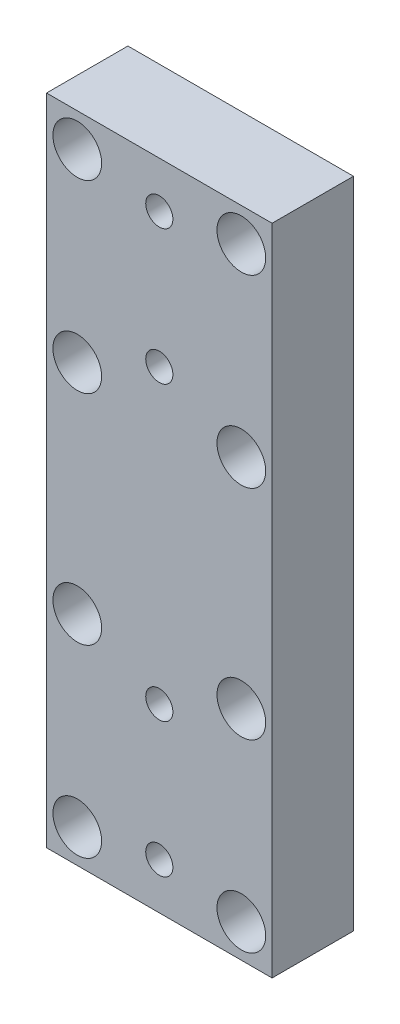
ISO-10303-21;
HEADER;
FILE_DESCRIPTION(('STEP AP214'),'2;1');
FILE_NAME('part.step','',(''),(''),'','','');
FILE_SCHEMA(('AUTOMOTIVE_DESIGN { 1 0 10303 214 1 1 1 1 }'));
ENDSEC;
DATA;
#1=APPLICATION_CONTEXT('core data for automotive mechanical design processes');
#2=APPLICATION_PROTOCOL_DEFINITION('international standard','automotive_design',2000,#1);
#3=PRODUCT_CONTEXT('',#1,'mechanical');
#4=PRODUCT('Part','Part','',(#3));
#5=PRODUCT_RELATED_PRODUCT_CATEGORY('part','',(#4));
#6=PRODUCT_DEFINITION_FORMATION('','',#4);
#7=PRODUCT_DEFINITION_CONTEXT('part definition',#1,'design');
#8=PRODUCT_DEFINITION('design','',#6,#7);
#9=PRODUCT_DEFINITION_SHAPE('','',#8);
#10=(LENGTH_UNIT() NAMED_UNIT(*) SI_UNIT(.MILLI.,.METRE.));
#11=(NAMED_UNIT(*) PLANE_ANGLE_UNIT() SI_UNIT($,.RADIAN.));
#12=(NAMED_UNIT(*) SI_UNIT($,.STERADIAN.) SOLID_ANGLE_UNIT());
#13=UNCERTAINTY_MEASURE_WITH_UNIT(LENGTH_MEASURE(1.E-05),#10,'distance_accuracy_value','');
#14=(GEOMETRIC_REPRESENTATION_CONTEXT(3) GLOBAL_UNCERTAINTY_ASSIGNED_CONTEXT((#13)) GLOBAL_UNIT_ASSIGNED_CONTEXT((#10,
#11,#12)) REPRESENTATION_CONTEXT('',''));
#15=CARTESIAN_POINT('',(0.,0.,0.));
#16=DIRECTION('',(0.,0.,1.));
#17=DIRECTION('',(1.,0.,0.));
#18=AXIS2_PLACEMENT_3D('',#15,#16,#17);
#19=CARTESIAN_POINT('',(-171.45,15.5,15.875));
#20=DIRECTION('',(0.,0.,-1.));
#21=DIRECTION('',(0.,1.,0.));
#22=AXIS2_PLACEMENT_3D('',#19,#20,#21);
#23=CYLINDRICAL_SURFACE('',#22,2.65000000000001);
#24=CARTESIAN_POINT('',(-171.45,15.5,15.875));
#25=DIRECTION('',(0.,0.,1.));
#26=DIRECTION('',(-1.,0.,0.));
#27=AXIS2_PLACEMENT_3D('',#24,#25,#26);
#28=CIRCLE('',#27,2.65000000000001);
#29=CARTESIAN_POINT('',(-174.1,15.5,15.875));
#30=VERTEX_POINT('',#29);
#31=EDGE_CURVE('E54',#30,#30,#28,.T.);
#32=ORIENTED_EDGE('',*,*,#31,.T.);
#33=EDGE_LOOP('',(#32));
#34=FACE_BOUND('',#33,.T.);
#35=CARTESIAN_POINT('',(-171.45,15.5,6.34999999999992));
#36=DIRECTION('',(0.,0.,1.));
#37=DIRECTION('',(-1.,0.,0.));
#38=AXIS2_PLACEMENT_3D('',#35,#36,#37);
#39=CIRCLE('',#38,2.65000000000001);
#40=CARTESIAN_POINT('',(-174.1,15.5,6.34999999999992));
#41=VERTEX_POINT('',#40);
#42=EDGE_CURVE('E410',#41,#41,#39,.T.);
#43=ORIENTED_EDGE('',*,*,#42,.F.);
#44=EDGE_LOOP('',(#43));
#45=FACE_BOUND('',#44,.T.);
#46=ADVANCED_FACE('F45',(#34,#45),#23,.F.);
#47=CARTESIAN_POINT('',(-171.45,-10.7547806533981,15.875));
#48=DIRECTION('',(0.,0.,-1.));
#49=DIRECTION('',(0.,1.,0.));
#50=AXIS2_PLACEMENT_3D('',#47,#48,#49);
#51=CYLINDRICAL_SURFACE('',#50,2.65000000000001);
#52=CARTESIAN_POINT('',(-171.45,-10.7547806533981,15.875));
#53=DIRECTION('',(0.,0.,1.));
#54=DIRECTION('',(-1.,0.,0.));
#55=AXIS2_PLACEMENT_3D('',#52,#53,#54);
#56=CIRCLE('',#55,2.65000000000001);
#57=CARTESIAN_POINT('',(-174.1,-10.7547806533981,15.875));
#58=VERTEX_POINT('',#57);
#59=EDGE_CURVE('E11',#58,#58,#56,.T.);
#60=ORIENTED_EDGE('',*,*,#59,.T.);
#61=EDGE_LOOP('',(#60));
#62=FACE_BOUND('',#61,.T.);
#63=CARTESIAN_POINT('',(-171.45,-10.7547806533981,6.34999999999996));
#64=DIRECTION('',(0.,0.,1.));
#65=DIRECTION('',(-1.,0.,0.));
#66=AXIS2_PLACEMENT_3D('',#63,#64,#65);
#67=CIRCLE('',#66,2.65000000000001);
#68=CARTESIAN_POINT('',(-174.1,-10.7547806533981,6.34999999999996));
#69=VERTEX_POINT('',#68);
#70=EDGE_CURVE('E419',#69,#69,#67,.T.);
#71=ORIENTED_EDGE('',*,*,#70,.F.);
#72=EDGE_LOOP('',(#71));
#73=FACE_BOUND('',#72,.T.);
#74=ADVANCED_FACE('F275',(#62,#73),#51,.F.);
#75=CARTESIAN_POINT('',(-171.45,-94.,53.975));
#76=DIRECTION('',(0.,0.,-1.));
#77=DIRECTION('',(-1.,0.,0.));
#78=AXIS2_PLACEMENT_3D('',#75,#76,#77);
#79=CYLINDRICAL_SURFACE('',#78,2.65000000000001);
#80=CARTESIAN_POINT('',(-171.45,-94.,15.875));
#81=DIRECTION('',(0.,0.,-1.));
#82=DIRECTION('',(-1.,0.,0.));
#83=AXIS2_PLACEMENT_3D('',#80,#81,#82);
#84=CIRCLE('',#83,2.65000000000001);
#85=CARTESIAN_POINT('',(-174.1,-94.,15.875));
#86=VERTEX_POINT('',#85);
#87=EDGE_CURVE('E171',#86,#86,#84,.T.);
#88=ORIENTED_EDGE('',*,*,#87,.F.);
#89=EDGE_LOOP('',(#88));
#90=FACE_BOUND('',#89,.T.);
#91=CARTESIAN_POINT('',(-171.45,-94.,6.35));
#92=DIRECTION('',(0.,0.,-1.));
#93=DIRECTION('',(-1.,0.,0.));
#94=AXIS2_PLACEMENT_3D('',#91,#92,#93);
#95=CIRCLE('',#94,2.65000000000001);
#96=CARTESIAN_POINT('',(-174.1,-94.,6.35));
#97=VERTEX_POINT('',#96);
#98=EDGE_CURVE('E203',#97,#97,#95,.T.);
#99=ORIENTED_EDGE('',*,*,#98,.T.);
#100=EDGE_LOOP('',(#99));
#101=FACE_BOUND('',#100,.T.);
#102=ADVANCED_FACE('F281',(#90,#101),#79,.F.);
#103=CARTESIAN_POINT('',(-171.45,-67.7452193466019,53.975));
#104=DIRECTION('',(0.,0.,-1.));
#105=DIRECTION('',(-1.,0.,0.));
#106=AXIS2_PLACEMENT_3D('',#103,#104,#105);
#107=CYLINDRICAL_SURFACE('',#106,2.65000000000001);
#108=CARTESIAN_POINT('',(-171.45,-67.7452193466019,15.875));
#109=DIRECTION('',(0.,0.,-1.));
#110=DIRECTION('',(-1.,0.,0.));
#111=AXIS2_PLACEMENT_3D('',#108,#109,#110);
#112=CIRCLE('',#111,2.65000000000001);
#113=CARTESIAN_POINT('',(-174.1,-67.7452193466019,15.875));
#114=VERTEX_POINT('',#113);
#115=EDGE_CURVE('E226',#114,#114,#112,.T.);
#116=ORIENTED_EDGE('',*,*,#115,.F.);
#117=EDGE_LOOP('',(#116));
#118=FACE_BOUND('',#117,.T.);
#119=CARTESIAN_POINT('',(-171.45,-67.7452193466019,6.35));
#120=DIRECTION('',(0.,0.,-1.));
#121=DIRECTION('',(-1.,0.,0.));
#122=AXIS2_PLACEMENT_3D('',#119,#120,#121);
#123=CIRCLE('',#122,2.65000000000001);
#124=CARTESIAN_POINT('',(-174.1,-67.7452193466019,6.35));
#125=VERTEX_POINT('',#124);
#126=EDGE_CURVE('E179',#125,#125,#123,.T.);
#127=ORIENTED_EDGE('',*,*,#126,.T.);
#128=EDGE_LOOP('',(#127));
#129=FACE_BOUND('',#128,.T.);
#130=ADVANCED_FACE('F272',(#118,#129),#107,.F.);
#131=CARTESIAN_POINT('',(0.,0.,6.35));
#132=DIRECTION('',(0.,0.,1.));
#133=DIRECTION('',(1.,0.,0.));
#134=AXIS2_PLACEMENT_3D('',#131,#132,#133);
#135=PLANE('',#134);
#136=CARTESIAN_POINT('',(-155.45,-96.5,6.35));
#137=DIRECTION('',(0.,0.,1.));
#138=DIRECTION('',(1.,0.,0.));
#139=AXIS2_PLACEMENT_3D('',#136,#137,#138);
#140=CIRCLE('',#139,2.64999999999999);
#141=CARTESIAN_POINT('',(-152.8,-96.5,6.35));
#142=VERTEX_POINT('',#141);
#143=EDGE_CURVE('E114',#142,#142,#140,.T.);
#144=ORIENTED_EDGE('',*,*,#143,.F.);
#145=EDGE_LOOP('',(#144));
#146=FACE_BOUND('',#145,.T.);
#147=CARTESIAN_POINT('',(-155.45,-96.5,6.35));
#148=DIRECTION('',(0.,0.,1.));
#149=DIRECTION('',(1.,0.,0.));
#150=AXIS2_PLACEMENT_3D('',#147,#148,#149);
#151=CIRCLE('',#150,4.75000000000001);
#152=CARTESIAN_POINT('',(-150.7,-96.5,6.35));
#153=VERTEX_POINT('',#152);
#154=EDGE_CURVE('E175',#153,#153,#151,.T.);
#155=ORIENTED_EDGE('',*,*,#154,.T.);
#156=EDGE_LOOP('',(#155));
#157=FACE_BOUND('',#156,.T.);
#158=ADVANCED_FACE('F258',(#146,#157),#135,.T.);
#159=CARTESIAN_POINT('',(-155.45,-60.5,6.35));
#160=DIRECTION('',(0.,0.,1.));
#161=DIRECTION('',(1.,0.,0.));
#162=AXIS2_PLACEMENT_3D('',#159,#160,#161);
#163=CIRCLE('',#162,2.65000000000002);
#164=CARTESIAN_POINT('',(-152.8,-60.5,6.35));
#165=VERTEX_POINT('',#164);
#166=EDGE_CURVE('E121',#165,#165,#163,.T.);
#167=ORIENTED_EDGE('',*,*,#166,.F.);
#168=EDGE_LOOP('',(#167));
#169=FACE_BOUND('',#168,.T.);
#170=CARTESIAN_POINT('',(-155.45,-60.5,6.35));
#171=DIRECTION('',(0.,0.,1.));
#172=DIRECTION('',(1.,0.,0.));
#173=AXIS2_PLACEMENT_3D('',#170,#171,#172);
#174=CIRCLE('',#173,4.75000000000001);
#175=CARTESIAN_POINT('',(-150.7,-60.5,6.35));
#176=VERTEX_POINT('',#175);
#177=EDGE_CURVE('E178',#176,#176,#174,.T.);
#178=ORIENTED_EDGE('',*,*,#177,.T.);
#179=EDGE_LOOP('',(#178));
#180=FACE_BOUND('',#179,.T.);
#181=ADVANCED_FACE('F271',(#169,#180),#135,.T.);
#182=CARTESIAN_POINT('',(-187.45,-18.,6.35));
#183=DIRECTION('',(0.,0.,1.));
#184=DIRECTION('',(1.,0.,0.));
#185=AXIS2_PLACEMENT_3D('',#182,#183,#184);
#186=CIRCLE('',#185,2.64999999999999);
#187=CARTESIAN_POINT('',(-184.8,-18.,6.35));
#188=VERTEX_POINT('',#187);
#189=EDGE_CURVE('E127',#188,#188,#186,.T.);
#190=ORIENTED_EDGE('',*,*,#189,.F.);
#191=EDGE_LOOP('',(#190));
#192=FACE_BOUND('',#191,.T.);
#193=CARTESIAN_POINT('',(-187.45,-18.,6.35));
#194=DIRECTION('',(0.,0.,1.));
#195=DIRECTION('',(1.,0.,0.));
#196=AXIS2_PLACEMENT_3D('',#193,#194,#195);
#197=CIRCLE('',#196,4.75);
#198=CARTESIAN_POINT('',(-182.7,-18.,6.35));
#199=VERTEX_POINT('',#198);
#200=EDGE_CURVE('E185',#199,#199,#197,.T.);
#201=ORIENTED_EDGE('',*,*,#200,.T.);
#202=EDGE_LOOP('',(#201));
#203=FACE_BOUND('',#202,.T.);
#204=ADVANCED_FACE('F345',(#192,#203),#135,.T.);
#205=CARTESIAN_POINT('',(-155.45,18.,6.35));
#206=DIRECTION('',(0.,0.,1.));
#207=DIRECTION('',(1.,0.,0.));
#208=AXIS2_PLACEMENT_3D('',#205,#206,#207);
#209=CIRCLE('',#208,2.64999999999999);
#210=CARTESIAN_POINT('',(-152.8,18.,6.35));
#211=VERTEX_POINT('',#210);
#212=EDGE_CURVE('E133',#211,#211,#209,.T.);
#213=ORIENTED_EDGE('',*,*,#212,.F.);
#214=EDGE_LOOP('',(#213));
#215=FACE_BOUND('',#214,.T.);
#216=CARTESIAN_POINT('',(-155.45,18.,6.35));
#217=DIRECTION('',(0.,0.,1.));
#218=DIRECTION('',(1.,0.,0.));
#219=AXIS2_PLACEMENT_3D('',#216,#217,#218);
#220=CIRCLE('',#219,4.75);
#221=CARTESIAN_POINT('',(-150.7,18.,6.35));
#222=VERTEX_POINT('',#221);
#223=EDGE_CURVE('E191',#222,#222,#220,.T.);
#224=ORIENTED_EDGE('',*,*,#223,.T.);
#225=EDGE_LOOP('',(#224));
#226=FACE_BOUND('',#225,.T.);
#227=ADVANCED_FACE('F342',(#215,#226),#135,.T.);
#228=CARTESIAN_POINT('',(-187.45,18.,6.35));
#229=DIRECTION('',(0.,0.,1.));
#230=DIRECTION('',(1.,0.,0.));
#231=AXIS2_PLACEMENT_3D('',#228,#229,#230);
#232=CIRCLE('',#231,2.64999999999999);
#233=CARTESIAN_POINT('',(-184.8,18.,6.35));
#234=VERTEX_POINT('',#233);
#235=EDGE_CURVE('E130',#234,#234,#232,.T.);
#236=ORIENTED_EDGE('',*,*,#235,.F.);
#237=EDGE_LOOP('',(#236));
#238=FACE_BOUND('',#237,.T.);
#239=CARTESIAN_POINT('',(-187.45,18.,6.35));
#240=DIRECTION('',(0.,0.,1.));
#241=DIRECTION('',(1.,0.,0.));
#242=AXIS2_PLACEMENT_3D('',#239,#240,#241);
#243=CIRCLE('',#242,4.75);
#244=CARTESIAN_POINT('',(-182.7,18.,6.35));
#245=VERTEX_POINT('',#244);
#246=EDGE_CURVE('E188',#245,#245,#243,.T.);
#247=ORIENTED_EDGE('',*,*,#246,.T.);
#248=EDGE_LOOP('',(#247));
#249=FACE_BOUND('',#248,.T.);
#250=ADVANCED_FACE('F344',(#238,#249),#135,.T.);
#251=CARTESIAN_POINT('',(-155.45,-18.,6.35));
#252=DIRECTION('',(0.,0.,1.));
#253=DIRECTION('',(1.,0.,0.));
#254=AXIS2_PLACEMENT_3D('',#251,#252,#253);
#255=CIRCLE('',#254,2.64999999999999);
#256=CARTESIAN_POINT('',(-152.8,-18.,6.35));
#257=VERTEX_POINT('',#256);
#258=EDGE_CURVE('E124',#257,#257,#255,.T.);
#259=ORIENTED_EDGE('',*,*,#258,.F.);
#260=EDGE_LOOP('',(#259));
#261=FACE_BOUND('',#260,.T.);
#262=CARTESIAN_POINT('',(-155.45,-18.,6.35));
#263=DIRECTION('',(0.,0.,1.));
#264=DIRECTION('',(1.,0.,0.));
#265=AXIS2_PLACEMENT_3D('',#262,#263,#264);
#266=CIRCLE('',#265,4.75);
#267=CARTESIAN_POINT('',(-150.7,-18.,6.35));
#268=VERTEX_POINT('',#267);
#269=EDGE_CURVE('E182',#268,#268,#266,.T.);
#270=ORIENTED_EDGE('',*,*,#269,.T.);
#271=EDGE_LOOP('',(#270));
#272=FACE_BOUND('',#271,.T.);
#273=ADVANCED_FACE('F266',(#261,#272),#135,.T.);
#274=CARTESIAN_POINT('',(-187.45,-60.5,6.35));
#275=DIRECTION('',(0.,0.,1.));
#276=DIRECTION('',(1.,0.,0.));
#277=AXIS2_PLACEMENT_3D('',#274,#275,#276);
#278=CIRCLE('',#277,2.64999999999998);
#279=CARTESIAN_POINT('',(-184.8,-60.5,6.35));
#280=VERTEX_POINT('',#279);
#281=EDGE_CURVE('E117',#280,#280,#278,.T.);
#282=ORIENTED_EDGE('',*,*,#281,.F.);
#283=EDGE_LOOP('',(#282));
#284=FACE_BOUND('',#283,.T.);
#285=CARTESIAN_POINT('',(-187.45,-60.5,6.35));
#286=DIRECTION('',(0.,0.,1.));
#287=DIRECTION('',(1.,0.,0.));
#288=AXIS2_PLACEMENT_3D('',#285,#286,#287);
#289=CIRCLE('',#288,4.75000000000001);
#290=CARTESIAN_POINT('',(-182.7,-60.5,6.35));
#291=VERTEX_POINT('',#290);
#292=EDGE_CURVE('E174',#291,#291,#289,.T.);
#293=ORIENTED_EDGE('',*,*,#292,.T.);
#294=EDGE_LOOP('',(#293));
#295=FACE_BOUND('',#294,.T.);
#296=ADVANCED_FACE('F255',(#284,#295),#135,.T.);
#297=CARTESIAN_POINT('',(-187.45,-96.5,6.35));
#298=DIRECTION('',(0.,0.,1.));
#299=DIRECTION('',(1.,0.,0.));
#300=AXIS2_PLACEMENT_3D('',#297,#298,#299);
#301=CIRCLE('',#300,2.64999999999999);
#302=CARTESIAN_POINT('',(-184.8,-96.5,6.35));
#303=VERTEX_POINT('',#302);
#304=EDGE_CURVE('E99',#303,#303,#301,.T.);
#305=ORIENTED_EDGE('',*,*,#304,.F.);
#306=EDGE_LOOP('',(#305));
#307=FACE_BOUND('',#306,.T.);
#308=CARTESIAN_POINT('',(-187.45,-96.5,6.35));
#309=DIRECTION('',(0.,0.,1.));
#310=DIRECTION('',(1.,0.,0.));
#311=AXIS2_PLACEMENT_3D('',#308,#309,#310);
#312=CIRCLE('',#311,4.75000000000001);
#313=CARTESIAN_POINT('',(-182.7,-96.5,6.35));
#314=VERTEX_POINT('',#313);
#315=EDGE_CURVE('E169',#314,#314,#312,.T.);
#316=ORIENTED_EDGE('',*,*,#315,.T.);
#317=EDGE_LOOP('',(#316));
#318=FACE_BOUND('',#317,.T.);
#319=ADVANCED_FACE('F253',(#307,#318),#135,.T.);
#320=CARTESIAN_POINT('',(-149.45,0.,6.35));
#321=DIRECTION('',(1.,0.,0.));
#322=DIRECTION('',(0.,0.,-1.));
#323=AXIS2_PLACEMENT_3D('',#320,#321,#322);
#324=PLANE('',#323);
#325=DIRECTION('',(0.,-1.,0.));
#326=VECTOR('',#325,1.);
#327=CARTESIAN_POINT('',(-149.45,0.,0.));
#328=LINE('',#327,#326);
#329=CARTESIAN_POINT('',(-149.45,24.5,0.));
#330=VERTEX_POINT('',#329);
#331=CARTESIAN_POINT('',(-149.45,-103.,0.));
#332=VERTEX_POINT('',#331);
#333=EDGE_CURVE('E95',#330,#332,#328,.T.);
#334=ORIENTED_EDGE('',*,*,#333,.F.);
#335=DIRECTION('',(0.,0.,-1.));
#336=VECTOR('',#335,1.);
#337=CARTESIAN_POINT('',(-149.45,24.5,6.35));
#338=LINE('',#337,#336);
#339=CARTESIAN_POINT('',(-149.45,24.5,15.875));
#340=VERTEX_POINT('',#339);
#341=EDGE_CURVE('E76',#340,#330,#338,.T.);
#342=ORIENTED_EDGE('',*,*,#341,.F.);
#343=DIRECTION('',(0.,-1.,0.));
#344=VECTOR('',#343,1.);
#345=CARTESIAN_POINT('',(-149.45,0.,15.875));
#346=LINE('',#345,#344);
#347=CARTESIAN_POINT('',(-149.45,-103.,15.875));
#348=VERTEX_POINT('',#347);
#349=EDGE_CURVE('E167',#340,#348,#346,.T.);
#350=ORIENTED_EDGE('',*,*,#349,.T.);
#351=DIRECTION('',(0.,0.,-1.));
#352=VECTOR('',#351,1.);
#353=CARTESIAN_POINT('',(-149.45,-103.,6.35));
#354=LINE('',#353,#352);
#355=EDGE_CURVE('E62',#348,#332,#354,.T.);
#356=ORIENTED_EDGE('',*,*,#355,.T.);
#357=EDGE_LOOP('',(#334,#342,#350,#356));
#358=FACE_BOUND('',#357,.T.);
#359=ADVANCED_FACE('F96',(#358),#324,.T.);
#360=CARTESIAN_POINT('',(0.,24.5,6.35));
#361=DIRECTION('',(0.,1.,0.));
#362=DIRECTION('',(0.,0.,1.));
#363=AXIS2_PLACEMENT_3D('',#360,#361,#362);
#364=PLANE('',#363);
#365=DIRECTION('',(1.,0.,0.));
#366=VECTOR('',#365,1.);
#367=CARTESIAN_POINT('',(0.,24.5,0.));
#368=LINE('',#367,#366);
#369=CARTESIAN_POINT('',(-193.45,24.5,0.));
#370=VERTEX_POINT('',#369);
#371=EDGE_CURVE('E89',#370,#330,#368,.T.);
#372=ORIENTED_EDGE('',*,*,#371,.F.);
#373=DIRECTION('',(0.,0.,-1.));
#374=VECTOR('',#373,1.);
#375=CARTESIAN_POINT('',(-193.45,24.5,6.35));
#376=LINE('',#375,#374);
#377=CARTESIAN_POINT('',(-193.45,24.5,15.875));
#378=VERTEX_POINT('',#377);
#379=EDGE_CURVE('E118',#378,#370,#376,.T.);
#380=ORIENTED_EDGE('',*,*,#379,.F.);
#381=DIRECTION('',(1.,0.,0.));
#382=VECTOR('',#381,1.);
#383=CARTESIAN_POINT('',(0.,24.5,15.875));
#384=LINE('',#383,#382);
#385=EDGE_CURVE('E91',#378,#340,#384,.T.);
#386=ORIENTED_EDGE('',*,*,#385,.T.);
#387=ORIENTED_EDGE('',*,*,#341,.T.);
#388=EDGE_LOOP('',(#372,#380,#386,#387));
#389=FACE_BOUND('',#388,.T.);
#390=ADVANCED_FACE('F87',(#389),#364,.T.);
#391=CARTESIAN_POINT('',(-193.45,0.,6.35));
#392=DIRECTION('',(1.,0.,0.));
#393=DIRECTION('',(0.,0.,-1.));
#394=AXIS2_PLACEMENT_3D('',#391,#392,#393);
#395=PLANE('',#394);
#396=DIRECTION('',(0.,-1.,0.));
#397=VECTOR('',#396,1.);
#398=CARTESIAN_POINT('',(-193.45,0.,0.));
#399=LINE('',#398,#397);
#400=CARTESIAN_POINT('',(-193.45,-103.,0.));
#401=VERTEX_POINT('',#400);
#402=EDGE_CURVE('E92',#370,#401,#399,.T.);
#403=ORIENTED_EDGE('',*,*,#402,.T.);
#404=DIRECTION('',(0.,0.,-1.));
#405=VECTOR('',#404,1.);
#406=CARTESIAN_POINT('',(-193.45,-103.,6.35));
#407=LINE('',#406,#405);
#408=CARTESIAN_POINT('',(-193.45,-103.,15.875));
#409=VERTEX_POINT('',#408);
#410=EDGE_CURVE('E113',#409,#401,#407,.T.);
#411=ORIENTED_EDGE('',*,*,#410,.F.);
#412=DIRECTION('',(0.,-1.,0.));
#413=VECTOR('',#412,1.);
#414=CARTESIAN_POINT('',(-193.45,0.,15.875));
#415=LINE('',#414,#413);
#416=EDGE_CURVE('E162',#378,#409,#415,.T.);
#417=ORIENTED_EDGE('',*,*,#416,.F.);
#418=ORIENTED_EDGE('',*,*,#379,.T.);
#419=EDGE_LOOP('',(#403,#411,#417,#418));
#420=FACE_BOUND('',#419,.T.);
#421=ADVANCED_FACE('F459',(#420),#395,.F.);
#422=CARTESIAN_POINT('',(-155.45,-96.5,6.35));
#423=DIRECTION('',(0.,0.,-1.));
#424=DIRECTION('',(-1.,0.,0.));
#425=AXIS2_PLACEMENT_3D('',#422,#423,#424);
#426=CYLINDRICAL_SURFACE('',#425,2.64999999999999);
#427=ORIENTED_EDGE('',*,*,#143,.T.);
#428=EDGE_LOOP('',(#427));
#429=FACE_BOUND('',#428,.T.);
#430=CARTESIAN_POINT('',(-155.45,-96.5,0.));
#431=DIRECTION('',(0.,0.,1.));
#432=DIRECTION('',(1.,0.,0.));
#433=AXIS2_PLACEMENT_3D('',#430,#431,#432);
#434=CIRCLE('',#433,2.64999999999999);
#435=CARTESIAN_POINT('',(-152.8,-96.5,0.));
#436=VERTEX_POINT('',#435);
#437=EDGE_CURVE('E387',#436,#436,#434,.T.);
#438=ORIENTED_EDGE('',*,*,#437,.F.);
#439=EDGE_LOOP('',(#438));
#440=FACE_BOUND('',#439,.T.);
#441=ADVANCED_FACE('F462',(#429,#440),#426,.F.);
#442=CARTESIAN_POINT('',(-187.45,-60.5,6.35));
#443=DIRECTION('',(0.,0.,-1.));
#444=DIRECTION('',(-1.,0.,0.));
#445=AXIS2_PLACEMENT_3D('',#442,#443,#444);
#446=CYLINDRICAL_SURFACE('',#445,2.64999999999998);
#447=ORIENTED_EDGE('',*,*,#281,.T.);
#448=EDGE_LOOP('',(#447));
#449=FACE_BOUND('',#448,.T.);
#450=CARTESIAN_POINT('',(-187.45,-60.5,0.));
#451=DIRECTION('',(0.,0.,1.));
#452=DIRECTION('',(1.,0.,0.));
#453=AXIS2_PLACEMENT_3D('',#450,#451,#452);
#454=CIRCLE('',#453,2.64999999999998);
#455=CARTESIAN_POINT('',(-184.8,-60.5,0.));
#456=VERTEX_POINT('',#455);
#457=EDGE_CURVE('E383',#456,#456,#454,.T.);
#458=ORIENTED_EDGE('',*,*,#457,.F.);
#459=EDGE_LOOP('',(#458));
#460=FACE_BOUND('',#459,.T.);
#461=ADVANCED_FACE('F480',(#449,#460),#446,.F.);
#462=CARTESIAN_POINT('',(-155.45,-60.5,6.35));
#463=DIRECTION('',(0.,0.,-1.));
#464=DIRECTION('',(-1.,0.,0.));
#465=AXIS2_PLACEMENT_3D('',#462,#463,#464);
#466=CYLINDRICAL_SURFACE('',#465,2.65000000000002);
#467=ORIENTED_EDGE('',*,*,#166,.T.);
#468=EDGE_LOOP('',(#467));
#469=FACE_BOUND('',#468,.T.);
#470=CARTESIAN_POINT('',(-155.45,-60.5,0.));
#471=DIRECTION('',(0.,0.,1.));
#472=DIRECTION('',(1.,0.,0.));
#473=AXIS2_PLACEMENT_3D('',#470,#471,#472);
#474=CIRCLE('',#473,2.65000000000002);
#475=CARTESIAN_POINT('',(-152.8,-60.5,0.));
#476=VERTEX_POINT('',#475);
#477=EDGE_CURVE('E379',#476,#476,#474,.T.);
#478=ORIENTED_EDGE('',*,*,#477,.F.);
#479=EDGE_LOOP('',(#478));
#480=FACE_BOUND('',#479,.T.);
#481=ADVANCED_FACE('F476',(#469,#480),#466,.F.);
#482=CARTESIAN_POINT('',(-155.45,-18.,6.35));
#483=DIRECTION('',(0.,0.,-1.));
#484=DIRECTION('',(-1.,0.,0.));
#485=AXIS2_PLACEMENT_3D('',#482,#483,#484);
#486=CYLINDRICAL_SURFACE('',#485,2.64999999999999);
#487=ORIENTED_EDGE('',*,*,#258,.T.);
#488=EDGE_LOOP('',(#487));
#489=FACE_BOUND('',#488,.T.);
#490=CARTESIAN_POINT('',(-155.45,-18.,0.));
#491=DIRECTION('',(0.,0.,1.));
#492=DIRECTION('',(1.,0.,0.));
#493=AXIS2_PLACEMENT_3D('',#490,#491,#492);
#494=CIRCLE('',#493,2.64999999999999);
#495=CARTESIAN_POINT('',(-152.8,-18.,0.));
#496=VERTEX_POINT('',#495);
#497=EDGE_CURVE('E375',#496,#496,#494,.T.);
#498=ORIENTED_EDGE('',*,*,#497,.F.);
#499=EDGE_LOOP('',(#498));
#500=FACE_BOUND('',#499,.T.);
#501=ADVANCED_FACE('F472',(#489,#500),#486,.F.);
#502=CARTESIAN_POINT('',(-187.45,-18.,6.35));
#503=DIRECTION('',(0.,0.,-1.));
#504=DIRECTION('',(-1.,0.,0.));
#505=AXIS2_PLACEMENT_3D('',#502,#503,#504);
#506=CYLINDRICAL_SURFACE('',#505,2.64999999999999);
#507=ORIENTED_EDGE('',*,*,#189,.T.);
#508=EDGE_LOOP('',(#507));
#509=FACE_BOUND('',#508,.T.);
#510=CARTESIAN_POINT('',(-187.45,-18.,0.));
#511=DIRECTION('',(0.,0.,1.));
#512=DIRECTION('',(1.,0.,0.));
#513=AXIS2_PLACEMENT_3D('',#510,#511,#512);
#514=CIRCLE('',#513,2.64999999999999);
#515=CARTESIAN_POINT('',(-184.8,-18.,0.));
#516=VERTEX_POINT('',#515);
#517=EDGE_CURVE('E371',#516,#516,#514,.T.);
#518=ORIENTED_EDGE('',*,*,#517,.F.);
#519=EDGE_LOOP('',(#518));
#520=FACE_BOUND('',#519,.T.);
#521=ADVANCED_FACE('F468',(#509,#520),#506,.F.);
#522=CARTESIAN_POINT('',(-187.45,18.,6.35));
#523=DIRECTION('',(0.,0.,-1.));
#524=DIRECTION('',(-1.,0.,0.));
#525=AXIS2_PLACEMENT_3D('',#522,#523,#524);
#526=CYLINDRICAL_SURFACE('',#525,2.64999999999999);
#527=ORIENTED_EDGE('',*,*,#235,.T.);
#528=EDGE_LOOP('',(#527));
#529=FACE_BOUND('',#528,.T.);
#530=CARTESIAN_POINT('',(-187.45,18.,0.));
#531=DIRECTION('',(0.,0.,1.));
#532=DIRECTION('',(1.,0.,0.));
#533=AXIS2_PLACEMENT_3D('',#530,#531,#532);
#534=CIRCLE('',#533,2.64999999999999);
#535=CARTESIAN_POINT('',(-184.8,18.,0.));
#536=VERTEX_POINT('',#535);
#537=EDGE_CURVE('E106',#536,#536,#534,.T.);
#538=ORIENTED_EDGE('',*,*,#537,.F.);
#539=EDGE_LOOP('',(#538));
#540=FACE_BOUND('',#539,.T.);
#541=ADVANCED_FACE('F361',(#529,#540),#526,.F.);
#542=CARTESIAN_POINT('',(-155.45,18.,6.35));
#543=DIRECTION('',(0.,0.,-1.));
#544=DIRECTION('',(-1.,0.,0.));
#545=AXIS2_PLACEMENT_3D('',#542,#543,#544);
#546=CYLINDRICAL_SURFACE('',#545,2.64999999999999);
#547=ORIENTED_EDGE('',*,*,#212,.T.);
#548=EDGE_LOOP('',(#547));
#549=FACE_BOUND('',#548,.T.);
#550=CARTESIAN_POINT('',(-155.45,18.,0.));
#551=DIRECTION('',(0.,0.,1.));
#552=DIRECTION('',(1.,0.,0.));
#553=AXIS2_PLACEMENT_3D('',#550,#551,#552);
#554=CIRCLE('',#553,2.64999999999999);
#555=CARTESIAN_POINT('',(-152.8,18.,0.));
#556=VERTEX_POINT('',#555);
#557=EDGE_CURVE('E103',#556,#556,#554,.T.);
#558=ORIENTED_EDGE('',*,*,#557,.F.);
#559=EDGE_LOOP('',(#558));
#560=FACE_BOUND('',#559,.T.);
#561=ADVANCED_FACE('F357',(#549,#560),#546,.F.);
#562=CARTESIAN_POINT('',(0.,-103.,6.35));
#563=DIRECTION('',(0.,1.,0.));
#564=DIRECTION('',(0.,0.,1.));
#565=AXIS2_PLACEMENT_3D('',#562,#563,#564);
#566=PLANE('',#565);
#567=DIRECTION('',(1.,0.,0.));
#568=VECTOR('',#567,1.);
#569=CARTESIAN_POINT('',(0.,-103.,0.));
#570=LINE('',#569,#568);
#571=EDGE_CURVE('E136',#401,#332,#570,.T.);
#572=ORIENTED_EDGE('',*,*,#571,.T.);
#573=ORIENTED_EDGE('',*,*,#355,.F.);
#574=DIRECTION('',(1.,0.,0.));
#575=VECTOR('',#574,1.);
#576=CARTESIAN_POINT('',(0.,-103.,15.875));
#577=LINE('',#576,#575);
#578=EDGE_CURVE('E165',#409,#348,#577,.T.);
#579=ORIENTED_EDGE('',*,*,#578,.F.);
#580=ORIENTED_EDGE('',*,*,#410,.T.);
#581=EDGE_LOOP('',(#572,#573,#579,#580));
#582=FACE_BOUND('',#581,.T.);
#583=ADVANCED_FACE('F360',(#582),#566,.F.);
#584=CARTESIAN_POINT('',(-187.45,-96.5,6.35));
#585=DIRECTION('',(0.,0.,-1.));
#586=DIRECTION('',(-1.,0.,0.));
#587=AXIS2_PLACEMENT_3D('',#584,#585,#586);
#588=CYLINDRICAL_SURFACE('',#587,2.64999999999999);
#589=ORIENTED_EDGE('',*,*,#304,.T.);
#590=EDGE_LOOP('',(#589));
#591=FACE_BOUND('',#590,.T.);
#592=CARTESIAN_POINT('',(-187.45,-96.5,0.));
#593=DIRECTION('',(0.,0.,1.));
#594=DIRECTION('',(1.,0.,0.));
#595=AXIS2_PLACEMENT_3D('',#592,#593,#594);
#596=CIRCLE('',#595,2.64999999999999);
#597=CARTESIAN_POINT('',(-184.8,-96.5,0.));
#598=VERTEX_POINT('',#597);
#599=EDGE_CURVE('E390',#598,#598,#596,.T.);
#600=ORIENTED_EDGE('',*,*,#599,.F.);
#601=EDGE_LOOP('',(#600));
#602=FACE_BOUND('',#601,.T.);
#603=ADVANCED_FACE('F337',(#591,#602),#588,.F.);
#604=CARTESIAN_POINT('',(0.,0.,0.));
#605=DIRECTION('',(0.,0.,1.));
#606=DIRECTION('',(1.,0.,0.));
#607=AXIS2_PLACEMENT_3D('',#604,#605,#606);
#608=PLANE('',#607);
#609=CARTESIAN_POINT('',(-171.45,-10.7547806533981,0.));
#610=DIRECTION('',(0.,0.,1.));
#611=DIRECTION('',(-1.,0.,0.));
#612=AXIS2_PLACEMENT_3D('',#609,#610,#611);
#613=CIRCLE('',#612,4.75000000000001);
#614=CARTESIAN_POINT('',(-176.2,-10.7547806533981,0.));
#615=VERTEX_POINT('',#614);
#616=EDGE_CURVE('E414',#615,#615,#613,.T.);
#617=ORIENTED_EDGE('',*,*,#616,.T.);
#618=EDGE_LOOP('',(#617));
#619=FACE_BOUND('',#618,.T.);
#620=CARTESIAN_POINT('',(-171.45,15.5,0.));
#621=DIRECTION('',(0.,0.,1.));
#622=DIRECTION('',(-1.,0.,0.));
#623=AXIS2_PLACEMENT_3D('',#620,#621,#622);
#624=CIRCLE('',#623,4.75000000000001);
#625=CARTESIAN_POINT('',(-176.2,15.5,0.));
#626=VERTEX_POINT('',#625);
#627=EDGE_CURVE('E407',#626,#626,#624,.T.);
#628=ORIENTED_EDGE('',*,*,#627,.T.);
#629=EDGE_LOOP('',(#628));
#630=FACE_BOUND('',#629,.T.);
#631=CARTESIAN_POINT('',(-171.45,-67.7452193466019,0.));
#632=DIRECTION('',(0.,0.,-1.));
#633=DIRECTION('',(-1.,0.,0.));
#634=AXIS2_PLACEMENT_3D('',#631,#632,#633);
#635=CIRCLE('',#634,4.75000000000001);
#636=CARTESIAN_POINT('',(-176.2,-67.7452193466019,0.));
#637=VERTEX_POINT('',#636);
#638=EDGE_CURVE('E140',#637,#637,#635,.T.);
#639=ORIENTED_EDGE('',*,*,#638,.F.);
#640=EDGE_LOOP('',(#639));
#641=FACE_BOUND('',#640,.T.);
#642=CARTESIAN_POINT('',(-171.45,-94.,0.));
#643=DIRECTION('',(0.,0.,-1.));
#644=DIRECTION('',(-1.,0.,0.));
#645=AXIS2_PLACEMENT_3D('',#642,#643,#644);
#646=CIRCLE('',#645,4.75000000000001);
#647=CARTESIAN_POINT('',(-176.2,-94.,0.));
#648=VERTEX_POINT('',#647);
#649=EDGE_CURVE('E196',#648,#648,#646,.T.);
#650=ORIENTED_EDGE('',*,*,#649,.F.);
#651=EDGE_LOOP('',(#650));
#652=FACE_BOUND('',#651,.T.);
#653=ORIENTED_EDGE('',*,*,#333,.T.);
#654=ORIENTED_EDGE('',*,*,#571,.F.);
#655=ORIENTED_EDGE('',*,*,#402,.F.);
#656=ORIENTED_EDGE('',*,*,#371,.T.);
#657=EDGE_LOOP('',(#653,#654,#655,#656));
#658=FACE_BOUND('',#657,.T.);
#659=ORIENTED_EDGE('',*,*,#557,.T.);
#660=EDGE_LOOP('',(#659));
#661=FACE_BOUND('',#660,.T.);
#662=ORIENTED_EDGE('',*,*,#537,.T.);
#663=EDGE_LOOP('',(#662));
#664=FACE_BOUND('',#663,.T.);
#665=ORIENTED_EDGE('',*,*,#517,.T.);
#666=EDGE_LOOP('',(#665));
#667=FACE_BOUND('',#666,.T.);
#668=ORIENTED_EDGE('',*,*,#497,.T.);
#669=EDGE_LOOP('',(#668));
#670=FACE_BOUND('',#669,.T.);
#671=ORIENTED_EDGE('',*,*,#477,.T.);
#672=EDGE_LOOP('',(#671));
#673=FACE_BOUND('',#672,.T.);
#674=ORIENTED_EDGE('',*,*,#457,.T.);
#675=EDGE_LOOP('',(#674));
#676=FACE_BOUND('',#675,.T.);
#677=ORIENTED_EDGE('',*,*,#437,.T.);
#678=EDGE_LOOP('',(#677));
#679=FACE_BOUND('',#678,.T.);
#680=ORIENTED_EDGE('',*,*,#599,.T.);
#681=EDGE_LOOP('',(#680));
#682=FACE_BOUND('',#681,.T.);
#683=ADVANCED_FACE('F47',(#619,#630,#641,#652,#658,#661,#664,#667,#670,#673,#676,#679,#682),
#608,.F.);
#684=CARTESIAN_POINT('',(-155.45,18.,150.753649162868));
#685=DIRECTION('',(0.,0.,-1.));
#686=DIRECTION('',(-1.,0.,0.));
#687=AXIS2_PLACEMENT_3D('',#684,#685,#686);
#688=CYLINDRICAL_SURFACE('',#687,4.75);
#689=CARTESIAN_POINT('',(-155.45,18.,15.875));
#690=DIRECTION('',(0.,0.,-1.));
#691=DIRECTION('',(-1.,0.,0.));
#692=AXIS2_PLACEMENT_3D('',#689,#690,#691);
#693=CIRCLE('',#692,4.75);
#694=CARTESIAN_POINT('',(-160.2,18.,15.875));
#695=VERTEX_POINT('',#694);
#696=EDGE_CURVE('E159',#695,#695,#693,.T.);
#697=ORIENTED_EDGE('',*,*,#696,.F.);
#698=EDGE_LOOP('',(#697));
#699=FACE_BOUND('',#698,.T.);
#700=ORIENTED_EDGE('',*,*,#223,.F.);
#701=EDGE_LOOP('',(#700));
#702=FACE_BOUND('',#701,.T.);
#703=ADVANCED_FACE('F329',(#699,#702),#688,.F.);
#704=CARTESIAN_POINT('',(-187.45,18.,150.753649162868));
#705=DIRECTION('',(0.,0.,-1.));
#706=DIRECTION('',(-1.,0.,0.));
#707=AXIS2_PLACEMENT_3D('',#704,#705,#706);
#708=CYLINDRICAL_SURFACE('',#707,4.75);
#709=CARTESIAN_POINT('',(-187.45,18.,15.875));
#710=DIRECTION('',(0.,0.,-1.));
#711=DIRECTION('',(-1.,0.,0.));
#712=AXIS2_PLACEMENT_3D('',#709,#710,#711);
#713=CIRCLE('',#712,4.75);
#714=CARTESIAN_POINT('',(-192.2,18.,15.875));
#715=VERTEX_POINT('',#714);
#716=EDGE_CURVE('E156',#715,#715,#713,.T.);
#717=ORIENTED_EDGE('',*,*,#716,.F.);
#718=EDGE_LOOP('',(#717));
#719=FACE_BOUND('',#718,.T.);
#720=ORIENTED_EDGE('',*,*,#246,.F.);
#721=EDGE_LOOP('',(#720));
#722=FACE_BOUND('',#721,.T.);
#723=ADVANCED_FACE('F325',(#719,#722),#708,.F.);
#724=CARTESIAN_POINT('',(-187.45,-18.,150.753649162868));
#725=DIRECTION('',(0.,0.,-1.));
#726=DIRECTION('',(-1.,0.,0.));
#727=AXIS2_PLACEMENT_3D('',#724,#725,#726);
#728=CYLINDRICAL_SURFACE('',#727,4.75);
#729=CARTESIAN_POINT('',(-187.45,-18.,15.875));
#730=DIRECTION('',(0.,0.,-1.));
#731=DIRECTION('',(-1.,0.,0.));
#732=AXIS2_PLACEMENT_3D('',#729,#730,#731);
#733=CIRCLE('',#732,4.75);
#734=CARTESIAN_POINT('',(-192.2,-18.,15.875));
#735=VERTEX_POINT('',#734);
#736=EDGE_CURVE('E153',#735,#735,#733,.T.);
#737=ORIENTED_EDGE('',*,*,#736,.F.);
#738=EDGE_LOOP('',(#737));
#739=FACE_BOUND('',#738,.T.);
#740=ORIENTED_EDGE('',*,*,#200,.F.);
#741=EDGE_LOOP('',(#740));
#742=FACE_BOUND('',#741,.T.);
#743=ADVANCED_FACE('F321',(#739,#742),#728,.F.);
#744=CARTESIAN_POINT('',(-155.45,-18.,150.753649162868));
#745=DIRECTION('',(0.,0.,-1.));
#746=DIRECTION('',(-1.,0.,0.));
#747=AXIS2_PLACEMENT_3D('',#744,#745,#746);
#748=CYLINDRICAL_SURFACE('',#747,4.75);
#749=CARTESIAN_POINT('',(-155.45,-18.,15.875));
#750=DIRECTION('',(0.,0.,-1.));
#751=DIRECTION('',(-1.,0.,0.));
#752=AXIS2_PLACEMENT_3D('',#749,#750,#751);
#753=CIRCLE('',#752,4.75);
#754=CARTESIAN_POINT('',(-160.2,-18.,15.875));
#755=VERTEX_POINT('',#754);
#756=EDGE_CURVE('E150',#755,#755,#753,.T.);
#757=ORIENTED_EDGE('',*,*,#756,.F.);
#758=EDGE_LOOP('',(#757));
#759=FACE_BOUND('',#758,.T.);
#760=ORIENTED_EDGE('',*,*,#269,.F.);
#761=EDGE_LOOP('',(#760));
#762=FACE_BOUND('',#761,.T.);
#763=ADVANCED_FACE('F317',(#759,#762),#748,.F.);
#764=CARTESIAN_POINT('',(-155.45,-60.5,150.753649162868));
#765=DIRECTION('',(0.,0.,-1.));
#766=DIRECTION('',(-1.,0.,0.));
#767=AXIS2_PLACEMENT_3D('',#764,#765,#766);
#768=CYLINDRICAL_SURFACE('',#767,4.75000000000001);
#769=CARTESIAN_POINT('',(-155.45,-60.5,15.875));
#770=DIRECTION('',(0.,0.,-1.));
#771=DIRECTION('',(-1.,0.,0.));
#772=AXIS2_PLACEMENT_3D('',#769,#770,#771);
#773=CIRCLE('',#772,4.75000000000001);
#774=CARTESIAN_POINT('',(-160.2,-60.5,15.875));
#775=VERTEX_POINT('',#774);
#776=EDGE_CURVE('E147',#775,#775,#773,.T.);
#777=ORIENTED_EDGE('',*,*,#776,.F.);
#778=EDGE_LOOP('',(#777));
#779=FACE_BOUND('',#778,.T.);
#780=ORIENTED_EDGE('',*,*,#177,.F.);
#781=EDGE_LOOP('',(#780));
#782=FACE_BOUND('',#781,.T.);
#783=ADVANCED_FACE('F313',(#779,#782),#768,.F.);
#784=CARTESIAN_POINT('',(-187.45,-60.5,150.753649162868));
#785=DIRECTION('',(0.,0.,-1.));
#786=DIRECTION('',(-1.,0.,0.));
#787=AXIS2_PLACEMENT_3D('',#784,#785,#786);
#788=CYLINDRICAL_SURFACE('',#787,4.75000000000001);
#789=CARTESIAN_POINT('',(-187.45,-60.5,15.875));
#790=DIRECTION('',(0.,0.,-1.));
#791=DIRECTION('',(-1.,0.,0.));
#792=AXIS2_PLACEMENT_3D('',#789,#790,#791);
#793=CIRCLE('',#792,4.75000000000001);
#794=CARTESIAN_POINT('',(-192.2,-60.5,15.875));
#795=VERTEX_POINT('',#794);
#796=EDGE_CURVE('E144',#795,#795,#793,.T.);
#797=ORIENTED_EDGE('',*,*,#796,.F.);
#798=EDGE_LOOP('',(#797));
#799=FACE_BOUND('',#798,.T.);
#800=ORIENTED_EDGE('',*,*,#292,.F.);
#801=EDGE_LOOP('',(#800));
#802=FACE_BOUND('',#801,.T.);
#803=ADVANCED_FACE('F309',(#799,#802),#788,.F.);
#804=CARTESIAN_POINT('',(-155.45,-96.5,150.753649162868));
#805=DIRECTION('',(0.,0.,-1.));
#806=DIRECTION('',(-1.,0.,0.));
#807=AXIS2_PLACEMENT_3D('',#804,#805,#806);
#808=CYLINDRICAL_SURFACE('',#807,4.75000000000001);
#809=CARTESIAN_POINT('',(-155.45,-96.5,15.875));
#810=DIRECTION('',(0.,0.,-1.));
#811=DIRECTION('',(-1.,0.,0.));
#812=AXIS2_PLACEMENT_3D('',#809,#810,#811);
#813=CIRCLE('',#812,4.75000000000001);
#814=CARTESIAN_POINT('',(-160.2,-96.5,15.875));
#815=VERTEX_POINT('',#814);
#816=EDGE_CURVE('E141',#815,#815,#813,.T.);
#817=ORIENTED_EDGE('',*,*,#816,.F.);
#818=EDGE_LOOP('',(#817));
#819=FACE_BOUND('',#818,.T.);
#820=ORIENTED_EDGE('',*,*,#154,.F.);
#821=EDGE_LOOP('',(#820));
#822=FACE_BOUND('',#821,.T.);
#823=ADVANCED_FACE('F249',(#819,#822),#808,.F.);
#824=CARTESIAN_POINT('',(-187.45,-96.5,150.753649162868));
#825=DIRECTION('',(0.,0.,-1.));
#826=DIRECTION('',(-1.,0.,0.));
#827=AXIS2_PLACEMENT_3D('',#824,#825,#826);
#828=CYLINDRICAL_SURFACE('',#827,4.75000000000001);
#829=CARTESIAN_POINT('',(-187.45,-96.5,15.875));
#830=DIRECTION('',(0.,0.,-1.));
#831=DIRECTION('',(-1.,0.,0.));
#832=AXIS2_PLACEMENT_3D('',#829,#830,#831);
#833=CIRCLE('',#832,4.75000000000001);
#834=CARTESIAN_POINT('',(-192.2,-96.5,15.875));
#835=VERTEX_POINT('',#834);
#836=EDGE_CURVE('E137',#835,#835,#833,.T.);
#837=ORIENTED_EDGE('',*,*,#836,.F.);
#838=EDGE_LOOP('',(#837));
#839=FACE_BOUND('',#838,.T.);
#840=ORIENTED_EDGE('',*,*,#315,.F.);
#841=EDGE_LOOP('',(#840));
#842=FACE_BOUND('',#841,.T.);
#843=ADVANCED_FACE('F221',(#839,#842),#828,.F.);
#844=CARTESIAN_POINT('',(-155.575,-55.1249999999999,15.875));
#845=DIRECTION('',(0.,0.,-1.));
#846=DIRECTION('',(-1.,0.,0.));
#847=AXIS2_PLACEMENT_3D('',#844,#845,#846);
#848=PLANE('',#847);
#849=ORIENTED_EDGE('',*,*,#59,.F.);
#850=EDGE_LOOP('',(#849));
#851=FACE_BOUND('',#850,.T.);
#852=ORIENTED_EDGE('',*,*,#31,.F.);
#853=EDGE_LOOP('',(#852));
#854=FACE_BOUND('',#853,.T.);
#855=ORIENTED_EDGE('',*,*,#115,.T.);
#856=EDGE_LOOP('',(#855));
#857=FACE_BOUND('',#856,.T.);
#858=ORIENTED_EDGE('',*,*,#87,.T.);
#859=EDGE_LOOP('',(#858));
#860=FACE_BOUND('',#859,.T.);
#861=ORIENTED_EDGE('',*,*,#578,.T.);
#862=ORIENTED_EDGE('',*,*,#349,.F.);
#863=ORIENTED_EDGE('',*,*,#385,.F.);
#864=ORIENTED_EDGE('',*,*,#416,.T.);
#865=EDGE_LOOP('',(#861,#862,#863,#864));
#866=FACE_BOUND('',#865,.T.);
#867=ORIENTED_EDGE('',*,*,#696,.T.);
#868=EDGE_LOOP('',(#867));
#869=FACE_BOUND('',#868,.T.);
#870=ORIENTED_EDGE('',*,*,#716,.T.);
#871=EDGE_LOOP('',(#870));
#872=FACE_BOUND('',#871,.T.);
#873=ORIENTED_EDGE('',*,*,#736,.T.);
#874=EDGE_LOOP('',(#873));
#875=FACE_BOUND('',#874,.T.);
#876=ORIENTED_EDGE('',*,*,#756,.T.);
#877=EDGE_LOOP('',(#876));
#878=FACE_BOUND('',#877,.T.);
#879=ORIENTED_EDGE('',*,*,#776,.T.);
#880=EDGE_LOOP('',(#879));
#881=FACE_BOUND('',#880,.T.);
#882=ORIENTED_EDGE('',*,*,#796,.T.);
#883=EDGE_LOOP('',(#882));
#884=FACE_BOUND('',#883,.T.);
#885=ORIENTED_EDGE('',*,*,#816,.T.);
#886=EDGE_LOOP('',(#885));
#887=FACE_BOUND('',#886,.T.);
#888=ORIENTED_EDGE('',*,*,#836,.T.);
#889=EDGE_LOOP('',(#888));
#890=FACE_BOUND('',#889,.T.);
#891=ADVANCED_FACE('F217',(#851,#854,#857,#860,#866,#869,#872,#875,#878,#881,#884,#887,#890),
#848,.F.);
#892=CARTESIAN_POINT('',(-171.45,-67.7452193466019,6.35));
#893=DIRECTION('',(0.,0.,-1.));
#894=DIRECTION('',(-1.,0.,0.));
#895=AXIS2_PLACEMENT_3D('',#892,#893,#894);
#896=CYLINDRICAL_SURFACE('',#895,4.75000000000001);
#897=CARTESIAN_POINT('',(-171.45,-67.7452193466019,6.35));
#898=DIRECTION('',(0.,0.,-1.));
#899=DIRECTION('',(-1.,0.,0.));
#900=AXIS2_PLACEMENT_3D('',#897,#898,#899);
#901=CIRCLE('',#900,4.75000000000001);
#902=CARTESIAN_POINT('',(-176.2,-67.7452193466019,6.35));
#903=VERTEX_POINT('',#902);
#904=EDGE_CURVE('E200',#903,#903,#901,.T.);
#905=ORIENTED_EDGE('',*,*,#904,.F.);
#906=EDGE_LOOP('',(#905));
#907=FACE_BOUND('',#906,.T.);
#908=ORIENTED_EDGE('',*,*,#638,.T.);
#909=EDGE_LOOP('',(#908));
#910=FACE_BOUND('',#909,.T.);
#911=ADVANCED_FACE('F220',(#907,#910),#896,.F.);
#912=CARTESIAN_POINT('',(0.,0.,6.35));
#913=DIRECTION('',(0.,0.,-1.));
#914=DIRECTION('',(-1.,0.,0.));
#915=AXIS2_PLACEMENT_3D('',#912,#913,#914);
#916=PLANE('',#915);
#917=ORIENTED_EDGE('',*,*,#126,.F.);
#918=EDGE_LOOP('',(#917));
#919=FACE_BOUND('',#918,.T.);
#920=ORIENTED_EDGE('',*,*,#904,.T.);
#921=EDGE_LOOP('',(#920));
#922=FACE_BOUND('',#921,.T.);
#923=ADVANCED_FACE('F285',(#919,#922),#916,.T.);
#924=CARTESIAN_POINT('',(-171.45,-94.,6.35));
#925=DIRECTION('',(0.,0.,-1.));
#926=DIRECTION('',(-1.,0.,0.));
#927=AXIS2_PLACEMENT_3D('',#924,#925,#926);
#928=CYLINDRICAL_SURFACE('',#927,4.75000000000001);
#929=CARTESIAN_POINT('',(-171.45,-94.,6.35));
#930=DIRECTION('',(0.,0.,-1.));
#931=DIRECTION('',(-1.,0.,0.));
#932=AXIS2_PLACEMENT_3D('',#929,#930,#931);
#933=CIRCLE('',#932,4.75000000000001);
#934=CARTESIAN_POINT('',(-176.2,-94.,6.35));
#935=VERTEX_POINT('',#934);
#936=EDGE_CURVE('E199',#935,#935,#933,.T.);
#937=ORIENTED_EDGE('',*,*,#936,.F.);
#938=EDGE_LOOP('',(#937));
#939=FACE_BOUND('',#938,.T.);
#940=ORIENTED_EDGE('',*,*,#649,.T.);
#941=EDGE_LOOP('',(#940));
#942=FACE_BOUND('',#941,.T.);
#943=ADVANCED_FACE('F288',(#939,#942),#928,.F.);
#944=CARTESIAN_POINT('',(0.,0.,6.35));
#945=DIRECTION('',(0.,0.,-1.));
#946=DIRECTION('',(-1.,0.,0.));
#947=AXIS2_PLACEMENT_3D('',#944,#945,#946);
#948=PLANE('',#947);
#949=ORIENTED_EDGE('',*,*,#98,.F.);
#950=EDGE_LOOP('',(#949));
#951=FACE_BOUND('',#950,.T.);
#952=ORIENTED_EDGE('',*,*,#936,.T.);
#953=EDGE_LOOP('',(#952));
#954=FACE_BOUND('',#953,.T.);
#955=ADVANCED_FACE('F293',(#951,#954),#948,.T.);
#956=CARTESIAN_POINT('',(-171.45,-10.7547806533981,6.34999999999996));
#957=DIRECTION('',(0.,0.,-1.));
#958=DIRECTION('',(0.,1.,0.));
#959=AXIS2_PLACEMENT_3D('',#956,#957,#958);
#960=CYLINDRICAL_SURFACE('',#959,4.75000000000001);
#961=CARTESIAN_POINT('',(-171.45,-10.7547806533981,6.34999999999996));
#962=DIRECTION('',(0.,0.,1.));
#963=DIRECTION('',(-1.,0.,0.));
#964=AXIS2_PLACEMENT_3D('',#961,#962,#963);
#965=CIRCLE('',#964,4.75000000000001);
#966=CARTESIAN_POINT('',(-176.2,-10.7547806533981,6.34999999999996));
#967=VERTEX_POINT('',#966);
#968=EDGE_CURVE('E206',#967,#967,#965,.T.);
#969=ORIENTED_EDGE('',*,*,#968,.T.);
#970=EDGE_LOOP('',(#969));
#971=FACE_BOUND('',#970,.T.);
#972=ORIENTED_EDGE('',*,*,#616,.F.);
#973=EDGE_LOOP('',(#972));
#974=FACE_BOUND('',#973,.T.);
#975=ADVANCED_FACE('F296',(#971,#974),#960,.F.);
#976=CARTESIAN_POINT('',(0.,-78.5,6.35000000000005));
#977=DIRECTION('',(0.,0.,-1.));
#978=DIRECTION('',(-1.,0.,0.));
#979=AXIS2_PLACEMENT_3D('',#976,#977,#978);
#980=PLANE('',#979);
#981=ORIENTED_EDGE('',*,*,#70,.T.);
#982=EDGE_LOOP('',(#981));
#983=FACE_BOUND('',#982,.T.);
#984=ORIENTED_EDGE('',*,*,#968,.F.);
#985=EDGE_LOOP('',(#984));
#986=FACE_BOUND('',#985,.T.);
#987=ADVANCED_FACE('F425',(#983,#986),#980,.T.);
#988=CARTESIAN_POINT('',(-171.45,15.5,6.34999999999992));
#989=DIRECTION('',(0.,0.,-1.));
#990=DIRECTION('',(0.,1.,0.));
#991=AXIS2_PLACEMENT_3D('',#988,#989,#990);
#992=CYLINDRICAL_SURFACE('',#991,4.75000000000001);
#993=CARTESIAN_POINT('',(-171.45,15.5,6.34999999999992));
#994=DIRECTION('',(0.,0.,1.));
#995=DIRECTION('',(-1.,0.,0.));
#996=AXIS2_PLACEMENT_3D('',#993,#994,#995);
#997=CIRCLE('',#996,4.75000000000001);
#998=CARTESIAN_POINT('',(-176.2,15.5,6.34999999999992));
#999=VERTEX_POINT('',#998);
#1000=EDGE_CURVE('E411',#999,#999,#997,.T.);
#1001=ORIENTED_EDGE('',*,*,#1000,.T.);
#1002=EDGE_LOOP('',(#1001));
#1003=FACE_BOUND('',#1002,.T.);
#1004=ORIENTED_EDGE('',*,*,#627,.F.);
#1005=EDGE_LOOP('',(#1004));
#1006=FACE_BOUND('',#1005,.T.);
#1007=ADVANCED_FACE('F429',(#1003,#1006),#992,.F.);
#1008=CARTESIAN_POINT('',(0.,-78.5,6.35000000000005));
#1009=DIRECTION('',(0.,0.,-1.));
#1010=DIRECTION('',(-1.,0.,0.));
#1011=AXIS2_PLACEMENT_3D('',#1008,#1009,#1010);
#1012=PLANE('',#1011);
#1013=ORIENTED_EDGE('',*,*,#42,.T.);
#1014=EDGE_LOOP('',(#1013));
#1015=FACE_BOUND('',#1014,.T.);
#1016=ORIENTED_EDGE('',*,*,#1000,.F.);
#1017=EDGE_LOOP('',(#1016));
#1018=FACE_BOUND('',#1017,.T.);
#1019=ADVANCED_FACE('F447',(#1015,#1018),#1012,.T.);
#1020=CLOSED_SHELL('',(#46,#74,#102,#130,#158,#181,#204,#227,#250,#273,#296,#319,#359,#390,#421,
#441,#461,#481,#501,#521,#541,#561,#583,#603,#683,#703,#723,#743,#763,#783,#803,#823,#843,#891,
#911,#923,#943,#955,#975,#987,#1007,#1019));
#1021=MANIFOLD_SOLID_BREP('B2',#1020);
#1022=ADVANCED_BREP_SHAPE_REPRESENTATION('',(#18,#1021),#14);
#1023=SHAPE_DEFINITION_REPRESENTATION(#9,#1022);
ENDSEC;
END-ISO-10303-21;
